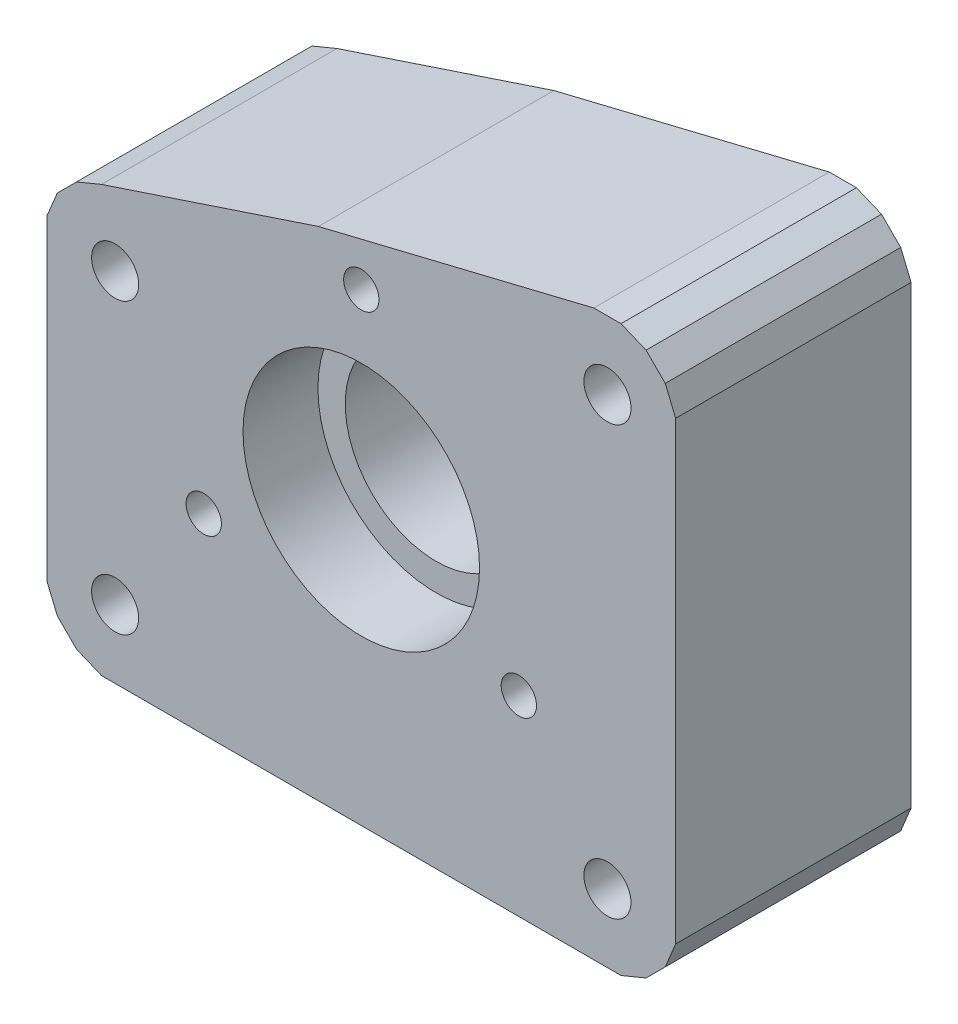
ISO-10303-21;
HEADER;
FILE_DESCRIPTION(('STEP AP214'),'2;1');
FILE_NAME('part.step','',(''),(''),'','','');
FILE_SCHEMA(('AUTOMOTIVE_DESIGN { 1 0 10303 214 1 1 1 1 }'));
ENDSEC;
DATA;
#1=APPLICATION_CONTEXT('core data for automotive mechanical design processes');
#2=APPLICATION_PROTOCOL_DEFINITION('international standard','automotive_design',2000,#1);
#3=PRODUCT_CONTEXT('',#1,'mechanical');
#4=PRODUCT('Part','Part','',(#3));
#5=PRODUCT_RELATED_PRODUCT_CATEGORY('part','',(#4));
#6=PRODUCT_DEFINITION_FORMATION('','',#4);
#7=PRODUCT_DEFINITION_CONTEXT('part definition',#1,'design');
#8=PRODUCT_DEFINITION('design','',#6,#7);
#9=PRODUCT_DEFINITION_SHAPE('','',#8);
#10=(LENGTH_UNIT() NAMED_UNIT(*) SI_UNIT(.MILLI.,.METRE.));
#11=(NAMED_UNIT(*) PLANE_ANGLE_UNIT() SI_UNIT($,.RADIAN.));
#12=(NAMED_UNIT(*) SI_UNIT($,.STERADIAN.) SOLID_ANGLE_UNIT());
#13=UNCERTAINTY_MEASURE_WITH_UNIT(LENGTH_MEASURE(1.E-05),#10,'distance_accuracy_value','');
#14=(GEOMETRIC_REPRESENTATION_CONTEXT(3) GLOBAL_UNCERTAINTY_ASSIGNED_CONTEXT((#13)) GLOBAL_UNIT_ASSIGNED_CONTEXT((#10,
#11,#12)) REPRESENTATION_CONTEXT('',''));
#15=CARTESIAN_POINT('',(0.,0.,0.));
#16=DIRECTION('',(0.,0.,1.));
#17=DIRECTION('',(1.,0.,0.));
#18=AXIS2_PLACEMENT_3D('',#15,#16,#17);
#19=CARTESIAN_POINT('',(0.,0.,56.));
#20=DIRECTION('',(0.,0.,-1.));
#21=DIRECTION('',(-1.,0.,0.));
#22=AXIS2_PLACEMENT_3D('',#19,#20,#21);
#23=CYLINDRICAL_SURFACE('',#22,8.5);
#24=CARTESIAN_POINT('',(0.,0.,41.));
#25=DIRECTION('',(0.,0.,1.));
#26=DIRECTION('',(1.,0.,0.));
#27=AXIS2_PLACEMENT_3D('',#24,#25,#26);
#28=CIRCLE('',#27,8.5);
#29=CARTESIAN_POINT('',(8.5,0.,41.));
#30=VERTEX_POINT('',#29);
#31=EDGE_CURVE('E280',#30,#30,#28,.T.);
#32=ORIENTED_EDGE('',*,*,#31,.F.);
#33=EDGE_LOOP('',(#32));
#34=FACE_BOUND('',#33,.T.);
#35=CARTESIAN_POINT('',(0.,0.,49.));
#36=DIRECTION('',(0.,0.,1.));
#37=DIRECTION('',(1.,0.,0.));
#38=AXIS2_PLACEMENT_3D('',#35,#36,#37);
#39=CIRCLE('',#38,8.5);
#40=CARTESIAN_POINT('',(8.5,0.,49.));
#41=VERTEX_POINT('',#40);
#42=EDGE_CURVE('E287',#41,#41,#39,.T.);
#43=ORIENTED_EDGE('',*,*,#42,.T.);
#44=EDGE_LOOP('',(#43));
#45=FACE_BOUND('',#44,.T.);
#46=ADVANCED_FACE('F43',(#34,#45),#23,.F.);
#47=CARTESIAN_POINT('',(0.,0.,56.));
#48=DIRECTION('',(0.,0.,1.));
#49=DIRECTION('',(1.,0.,0.));
#50=AXIS2_PLACEMENT_3D('',#47,#48,#49);
#51=PLANE('',#50);
#52=CARTESIAN_POINT('',(0.,0.,56.));
#53=DIRECTION('',(0.,0.,1.));
#54=DIRECTION('',(1.,0.,0.));
#55=AXIS2_PLACEMENT_3D('',#52,#53,#54);
#56=CIRCLE('',#55,11.05);
#57=CARTESIAN_POINT('',(11.05,0.,56.));
#58=VERTEX_POINT('',#57);
#59=EDGE_CURVE('E47',#58,#58,#56,.F.);
#60=ORIENTED_EDGE('',*,*,#59,.T.);
#61=EDGE_LOOP('',(#60));
#62=FACE_BOUND('',#61,.T.);
#63=CARTESIAN_POINT('',(-14.7224318643355,-8.5,56.));
#64=DIRECTION('',(0.,0.,1.));
#65=DIRECTION('',(1.,0.,0.));
#66=AXIS2_PLACEMENT_3D('',#63,#64,#65);
#67=CIRCLE('',#66,1.65);
#68=CARTESIAN_POINT('',(-13.0724318643355,-8.5,56.));
#69=VERTEX_POINT('',#68);
#70=EDGE_CURVE('E306',#69,#69,#67,.T.);
#71=ORIENTED_EDGE('',*,*,#70,.F.);
#72=EDGE_LOOP('',(#71));
#73=FACE_BOUND('',#72,.T.);
#74=CARTESIAN_POINT('',(23.,20.,56.));
#75=DIRECTION('',(0.,0.,1.));
#76=DIRECTION('',(1.,0.,0.));
#77=AXIS2_PLACEMENT_3D('',#74,#75,#76);
#78=CIRCLE('',#77,2.2);
#79=CARTESIAN_POINT('',(25.2,20.,56.));
#80=VERTEX_POINT('',#79);
#81=EDGE_CURVE('E318',#80,#80,#78,.T.);
#82=ORIENTED_EDGE('',*,*,#81,.F.);
#83=EDGE_LOOP('',(#82));
#84=FACE_BOUND('',#83,.T.);
#85=CARTESIAN_POINT('',(23.,-20.,56.));
#86=DIRECTION('',(0.,0.,1.));
#87=DIRECTION('',(1.,0.,0.));
#88=AXIS2_PLACEMENT_3D('',#85,#86,#87);
#89=CIRCLE('',#88,2.2);
#90=CARTESIAN_POINT('',(25.2,-20.,56.));
#91=VERTEX_POINT('',#90);
#92=EDGE_CURVE('E330',#91,#91,#89,.T.);
#93=ORIENTED_EDGE('',*,*,#92,.F.);
#94=EDGE_LOOP('',(#93));
#95=FACE_BOUND('',#94,.T.);
#96=DIRECTION('',(0.923879532511286,-0.382683432365091,0.));
#97=VECTOR('',#96,1.);
#98=CARTESIAN_POINT('',(-26.6112065146274,-25.4045524799665,56.));
#99=LINE('',#98,#97);
#100=CARTESIAN_POINT('',(-26.6112065146274,-25.4045524799665,56.));
#101=VERTEX_POINT('',#100);
#102=CARTESIAN_POINT('',(-24.2680870931048,-26.375104322621,56.));
#103=VERTEX_POINT('',#102);
#104=EDGE_CURVE('E238',#101,#103,#99,.T.);
#105=ORIENTED_EDGE('',*,*,#104,.T.);
#106=DIRECTION('',(1.,0.,0.));
#107=VECTOR('',#106,1.);
#108=CARTESIAN_POINT('',(-24.2680870931048,-26.375104322621,56.));
#109=LINE('',#108,#107);
#110=CARTESIAN_POINT('',(24.2680870931048,-26.375104322621,56.));
#111=VERTEX_POINT('',#110);
#112=EDGE_CURVE('E135',#103,#111,#109,.T.);
#113=ORIENTED_EDGE('',*,*,#112,.T.);
#114=DIRECTION('',(0.923879532511287,0.38268343236509,0.));
#115=VECTOR('',#114,1.);
#116=CARTESIAN_POINT('',(24.2680870931048,-26.375104322621,56.));
#117=LINE('',#116,#115);
#118=CARTESIAN_POINT('',(26.6112065146274,-25.4045524799665,56.));
#119=VERTEX_POINT('',#118);
#120=EDGE_CURVE('E342',#111,#119,#117,.T.);
#121=ORIENTED_EDGE('',*,*,#120,.T.);
#122=DIRECTION('',(0.707106781186548,0.707106781186547,0.));
#123=VECTOR('',#122,1.);
#124=CARTESIAN_POINT('',(26.6112065146274,-25.4045524799665,56.));
#125=LINE('',#124,#123);
#126=CARTESIAN_POINT('',(28.4045524799665,-23.6112065146274,56.));
#127=VERTEX_POINT('',#126);
#128=EDGE_CURVE('E344',#119,#127,#125,.T.);
#129=ORIENTED_EDGE('',*,*,#128,.T.);
#130=DIRECTION('',(0.382683432365089,0.923879532511287,0.));
#131=VECTOR('',#130,1.);
#132=CARTESIAN_POINT('',(28.4045524799665,-23.6112065146274,56.));
#133=LINE('',#132,#131);
#134=CARTESIAN_POINT('',(29.375104322621,-21.2680870931048,56.));
#135=VERTEX_POINT('',#134);
#136=EDGE_CURVE('E346',#127,#135,#133,.T.);
#137=ORIENTED_EDGE('',*,*,#136,.T.);
#138=DIRECTION('',(0.,1.,0.));
#139=VECTOR('',#138,1.);
#140=CARTESIAN_POINT('',(29.375104322621,-21.2680870931048,56.));
#141=LINE('',#140,#139);
#142=CARTESIAN_POINT('',(29.375104322621,21.2680870931048,56.));
#143=VERTEX_POINT('',#142);
#144=EDGE_CURVE('E348',#135,#143,#141,.T.);
#145=ORIENTED_EDGE('',*,*,#144,.T.);
#146=DIRECTION('',(-0.382683432365089,0.923879532511287,0.));
#147=VECTOR('',#146,1.);
#148=CARTESIAN_POINT('',(29.375104322621,21.2680870931048,56.));
#149=LINE('',#148,#147);
#150=CARTESIAN_POINT('',(28.4045524799665,23.6112065146274,56.));
#151=VERTEX_POINT('',#150);
#152=EDGE_CURVE('E350',#143,#151,#149,.T.);
#153=ORIENTED_EDGE('',*,*,#152,.T.);
#154=DIRECTION('',(-0.707106781186548,0.707106781186547,0.));
#155=VECTOR('',#154,1.);
#156=CARTESIAN_POINT('',(28.4045524799665,23.6112065146274,56.));
#157=LINE('',#156,#155);
#158=CARTESIAN_POINT('',(26.6112065146274,25.4045524799665,56.));
#159=VERTEX_POINT('',#158);
#160=EDGE_CURVE('E352',#151,#159,#157,.T.);
#161=ORIENTED_EDGE('',*,*,#160,.T.);
#162=DIRECTION('',(-0.923879532511286,0.382683432365091,0.));
#163=VECTOR('',#162,1.);
#164=CARTESIAN_POINT('',(26.6112065146274,25.4045524799665,56.));
#165=LINE('',#164,#163);
#166=CARTESIAN_POINT('',(24.2680870931048,26.375104322621,56.));
#167=VERTEX_POINT('',#166);
#168=EDGE_CURVE('E354',#159,#167,#165,.T.);
#169=ORIENTED_EDGE('',*,*,#168,.T.);
#170=DIRECTION('',(-1.,0.,0.));
#171=VECTOR('',#170,1.);
#172=CARTESIAN_POINT('',(24.2680870931048,26.375104322621,56.));
#173=LINE('',#172,#171);
#174=CARTESIAN_POINT('',(21.7319129068952,26.375104322621,56.));
#175=VERTEX_POINT('',#174);
#176=EDGE_CURVE('E356',#167,#175,#173,.T.);
#177=ORIENTED_EDGE('',*,*,#176,.T.);
#178=DIRECTION('',(-0.971580389978421,-0.236709834627504,0.));
#179=VECTOR('',#178,1.);
#180=CARTESIAN_POINT('',(21.7319129068952,26.375104322621,56.));
#181=LINE('',#180,#179);
#182=CARTESIAN_POINT('',(-3.99935160133063,20.1060982482662,56.));
#183=VERTEX_POINT('',#182);
#184=EDGE_CURVE('E358',#175,#183,#181,.T.);
#185=ORIENTED_EDGE('',*,*,#184,.T.);
#186=DIRECTION('',(-0.949037400798364,-0.315163468514175,0.));
#187=VECTOR('',#186,1.);
#188=CARTESIAN_POINT('',(-3.99935160133063,20.1060982482662,56.));
#189=LINE('',#188,#187);
#190=CARTESIAN_POINT('',(-24.2680870931048,13.375104322621,56.));
#191=VERTEX_POINT('',#190);
#192=EDGE_CURVE('E360',#183,#191,#189,.T.);
#193=ORIENTED_EDGE('',*,*,#192,.T.);
#194=DIRECTION('',(-0.923879532511287,-0.382683432365089,0.));
#195=VECTOR('',#194,1.);
#196=CARTESIAN_POINT('',(-24.2680870931048,13.375104322621,56.));
#197=LINE('',#196,#195);
#198=CARTESIAN_POINT('',(-26.6112065146274,12.4045524799665,56.));
#199=VERTEX_POINT('',#198);
#200=EDGE_CURVE('E362',#191,#199,#197,.T.);
#201=ORIENTED_EDGE('',*,*,#200,.T.);
#202=DIRECTION('',(-0.707106781186547,-0.707106781186547,0.));
#203=VECTOR('',#202,1.);
#204=CARTESIAN_POINT('',(-26.6112065146274,12.4045524799665,56.));
#205=LINE('',#204,#203);
#206=CARTESIAN_POINT('',(-28.4045524799665,10.6112065146274,56.));
#207=VERTEX_POINT('',#206);
#208=EDGE_CURVE('E364',#199,#207,#205,.T.);
#209=ORIENTED_EDGE('',*,*,#208,.T.);
#210=DIRECTION('',(-0.38268343236509,-0.923879532511287,0.));
#211=VECTOR('',#210,1.);
#212=CARTESIAN_POINT('',(-28.4045524799665,10.6112065146274,56.));
#213=LINE('',#212,#211);
#214=CARTESIAN_POINT('',(-29.375104322621,8.26808709310483,56.));
#215=VERTEX_POINT('',#214);
#216=EDGE_CURVE('E185',#207,#215,#213,.T.);
#217=ORIENTED_EDGE('',*,*,#216,.T.);
#218=DIRECTION('',(0.,-1.,0.));
#219=VECTOR('',#218,1.);
#220=CARTESIAN_POINT('',(-29.375104322621,8.26808709310483,56.));
#221=LINE('',#220,#219);
#222=CARTESIAN_POINT('',(-29.375104322621,-21.2680870931048,56.));
#223=VERTEX_POINT('',#222);
#224=EDGE_CURVE('E178',#215,#223,#221,.T.);
#225=ORIENTED_EDGE('',*,*,#224,.T.);
#226=DIRECTION('',(0.382683432365089,-0.923879532511287,0.));
#227=VECTOR('',#226,1.);
#228=CARTESIAN_POINT('',(-29.375104322621,-21.2680870931048,56.));
#229=LINE('',#228,#227);
#230=CARTESIAN_POINT('',(-28.4045524799665,-23.6112065146274,56.));
#231=VERTEX_POINT('',#230);
#232=EDGE_CURVE('E183',#223,#231,#229,.T.);
#233=ORIENTED_EDGE('',*,*,#232,.T.);
#234=DIRECTION('',(0.707106781186548,-0.707106781186547,0.));
#235=VECTOR('',#234,1.);
#236=CARTESIAN_POINT('',(-28.4045524799665,-23.6112065146274,56.));
#237=LINE('',#236,#235);
#238=EDGE_CURVE('E62',#231,#101,#237,.T.);
#239=ORIENTED_EDGE('',*,*,#238,.T.);
#240=EDGE_LOOP('',(#105,#113,#121,#129,#137,#145,#153,#161,#169,#177,#185,#193,#201,#209,#217,
#225,#233,#239));
#241=FACE_BOUND('',#240,.T.);
#242=CARTESIAN_POINT('',(-23.,-20.,56.));
#243=DIRECTION('',(0.,0.,1.));
#244=DIRECTION('',(1.,0.,0.));
#245=AXIS2_PLACEMENT_3D('',#242,#243,#244);
#246=CIRCLE('',#245,2.2);
#247=CARTESIAN_POINT('',(-20.8,-20.,56.));
#248=VERTEX_POINT('',#247);
#249=EDGE_CURVE('E207',#248,#248,#246,.T.);
#250=ORIENTED_EDGE('',*,*,#249,.F.);
#251=EDGE_LOOP('',(#250));
#252=FACE_BOUND('',#251,.T.);
#253=CARTESIAN_POINT('',(-23.,7.,56.));
#254=DIRECTION('',(0.,0.,1.));
#255=DIRECTION('',(1.,0.,0.));
#256=AXIS2_PLACEMENT_3D('',#253,#254,#255);
#257=CIRCLE('',#256,2.2);
#258=CARTESIAN_POINT('',(-20.8,7.,56.));
#259=VERTEX_POINT('',#258);
#260=EDGE_CURVE('E324',#259,#259,#257,.T.);
#261=ORIENTED_EDGE('',*,*,#260,.F.);
#262=EDGE_LOOP('',(#261));
#263=FACE_BOUND('',#262,.T.);
#264=CARTESIAN_POINT('',(0.,17.,56.));
#265=DIRECTION('',(0.,0.,1.));
#266=DIRECTION('',(1.,0.,0.));
#267=AXIS2_PLACEMENT_3D('',#264,#265,#266);
#268=CIRCLE('',#267,1.65);
#269=CARTESIAN_POINT('',(1.65,17.,56.));
#270=VERTEX_POINT('',#269);
#271=EDGE_CURVE('E312',#270,#270,#268,.T.);
#272=ORIENTED_EDGE('',*,*,#271,.F.);
#273=EDGE_LOOP('',(#272));
#274=FACE_BOUND('',#273,.T.);
#275=CARTESIAN_POINT('',(14.7224318643355,-8.50000000000001,56.));
#276=DIRECTION('',(0.,0.,1.));
#277=DIRECTION('',(1.,0.,0.));
#278=AXIS2_PLACEMENT_3D('',#275,#276,#277);
#279=CIRCLE('',#278,1.65);
#280=CARTESIAN_POINT('',(16.3724318643355,-8.50000000000001,56.));
#281=VERTEX_POINT('',#280);
#282=EDGE_CURVE('E300',#281,#281,#279,.T.);
#283=ORIENTED_EDGE('',*,*,#282,.F.);
#284=EDGE_LOOP('',(#283));
#285=FACE_BOUND('',#284,.T.);
#286=ADVANCED_FACE('F180',(#62,#73,#84,#95,#241,#252,#263,#274,#285),#51,.T.);
#287=CARTESIAN_POINT('',(0.,0.,34.));
#288=DIRECTION('',(0.,0.,1.));
#289=DIRECTION('',(1.,0.,0.));
#290=AXIS2_PLACEMENT_3D('',#287,#288,#289);
#291=PLANE('',#290);
#292=CARTESIAN_POINT('',(0.,0.,34.));
#293=DIRECTION('',(0.,0.,1.));
#294=DIRECTION('',(1.,0.,0.));
#295=AXIS2_PLACEMENT_3D('',#292,#293,#294);
#296=CIRCLE('',#295,11.05);
#297=CARTESIAN_POINT('',(11.05,0.,34.));
#298=VERTEX_POINT('',#297);
#299=EDGE_CURVE('E283',#298,#298,#296,.F.);
#300=ORIENTED_EDGE('',*,*,#299,.F.);
#301=EDGE_LOOP('',(#300));
#302=FACE_BOUND('',#301,.T.);
#303=DIRECTION('',(0.923879532511286,-0.382683432365091,0.));
#304=VECTOR('',#303,1.);
#305=CARTESIAN_POINT('',(-26.6112065146274,-25.4045524799665,34.));
#306=LINE('',#305,#304);
#307=CARTESIAN_POINT('',(-26.6112065146274,-25.4045524799665,34.));
#308=VERTEX_POINT('',#307);
#309=CARTESIAN_POINT('',(-24.2680870931048,-26.375104322621,34.));
#310=VERTEX_POINT('',#309);
#311=EDGE_CURVE('E203',#308,#310,#306,.T.);
#312=ORIENTED_EDGE('',*,*,#311,.F.);
#313=DIRECTION('',(0.707106781186548,-0.707106781186547,0.));
#314=VECTOR('',#313,1.);
#315=CARTESIAN_POINT('',(-28.4045524799665,-23.6112065146274,34.));
#316=LINE('',#315,#314);
#317=CARTESIAN_POINT('',(-28.4045524799665,-23.6112065146274,34.));
#318=VERTEX_POINT('',#317);
#319=EDGE_CURVE('E127',#318,#308,#316,.T.);
#320=ORIENTED_EDGE('',*,*,#319,.F.);
#321=DIRECTION('',(0.382683432365089,-0.923879532511287,0.));
#322=VECTOR('',#321,1.);
#323=CARTESIAN_POINT('',(-29.375104322621,-21.2680870931048,34.));
#324=LINE('',#323,#322);
#325=CARTESIAN_POINT('',(-29.375104322621,-21.2680870931048,34.));
#326=VERTEX_POINT('',#325);
#327=EDGE_CURVE('E121',#326,#318,#324,.T.);
#328=ORIENTED_EDGE('',*,*,#327,.F.);
#329=DIRECTION('',(0.,-1.,0.));
#330=VECTOR('',#329,1.);
#331=CARTESIAN_POINT('',(-29.375104322621,8.26808709310483,34.));
#332=LINE('',#331,#330);
#333=CARTESIAN_POINT('',(-29.375104322621,8.26808709310483,34.));
#334=VERTEX_POINT('',#333);
#335=EDGE_CURVE('E193',#334,#326,#332,.T.);
#336=ORIENTED_EDGE('',*,*,#335,.F.);
#337=DIRECTION('',(-0.38268343236509,-0.923879532511287,0.));
#338=VECTOR('',#337,1.);
#339=CARTESIAN_POINT('',(-28.4045524799665,10.6112065146274,34.));
#340=LINE('',#339,#338);
#341=CARTESIAN_POINT('',(-28.4045524799665,10.6112065146274,34.));
#342=VERTEX_POINT('',#341);
#343=EDGE_CURVE('E233',#342,#334,#340,.T.);
#344=ORIENTED_EDGE('',*,*,#343,.F.);
#345=DIRECTION('',(-0.707106781186547,-0.707106781186547,0.));
#346=VECTOR('',#345,1.);
#347=CARTESIAN_POINT('',(-26.6112065146274,12.4045524799665,34.));
#348=LINE('',#347,#346);
#349=CARTESIAN_POINT('',(-26.6112065146274,12.4045524799665,34.));
#350=VERTEX_POINT('',#349);
#351=EDGE_CURVE('E231',#350,#342,#348,.T.);
#352=ORIENTED_EDGE('',*,*,#351,.F.);
#353=DIRECTION('',(-0.923879532511287,-0.382683432365089,0.));
#354=VECTOR('',#353,1.);
#355=CARTESIAN_POINT('',(-24.2680870931048,13.375104322621,34.));
#356=LINE('',#355,#354);
#357=CARTESIAN_POINT('',(-24.2680870931048,13.375104322621,34.));
#358=VERTEX_POINT('',#357);
#359=EDGE_CURVE('E229',#358,#350,#356,.T.);
#360=ORIENTED_EDGE('',*,*,#359,.F.);
#361=DIRECTION('',(-0.949037400798364,-0.315163468514175,0.));
#362=VECTOR('',#361,1.);
#363=CARTESIAN_POINT('',(-3.99935160133063,20.1060982482662,34.));
#364=LINE('',#363,#362);
#365=CARTESIAN_POINT('',(-3.99935160133063,20.1060982482662,34.));
#366=VERTEX_POINT('',#365);
#367=EDGE_CURVE('E227',#366,#358,#364,.T.);
#368=ORIENTED_EDGE('',*,*,#367,.F.);
#369=DIRECTION('',(-0.971580389978421,-0.236709834627504,0.));
#370=VECTOR('',#369,1.);
#371=CARTESIAN_POINT('',(21.7319129068952,26.375104322621,34.));
#372=LINE('',#371,#370);
#373=CARTESIAN_POINT('',(21.7319129068952,26.375104322621,34.));
#374=VERTEX_POINT('',#373);
#375=EDGE_CURVE('E225',#374,#366,#372,.T.);
#376=ORIENTED_EDGE('',*,*,#375,.F.);
#377=DIRECTION('',(-1.,0.,0.));
#378=VECTOR('',#377,1.);
#379=CARTESIAN_POINT('',(24.2680870931048,26.375104322621,34.));
#380=LINE('',#379,#378);
#381=CARTESIAN_POINT('',(24.2680870931048,26.375104322621,34.));
#382=VERTEX_POINT('',#381);
#383=EDGE_CURVE('E223',#382,#374,#380,.T.);
#384=ORIENTED_EDGE('',*,*,#383,.F.);
#385=DIRECTION('',(-0.923879532511286,0.382683432365091,0.));
#386=VECTOR('',#385,1.);
#387=CARTESIAN_POINT('',(26.6112065146274,25.4045524799665,34.));
#388=LINE('',#387,#386);
#389=CARTESIAN_POINT('',(26.6112065146274,25.4045524799665,34.));
#390=VERTEX_POINT('',#389);
#391=EDGE_CURVE('E221',#390,#382,#388,.T.);
#392=ORIENTED_EDGE('',*,*,#391,.F.);
#393=DIRECTION('',(-0.707106781186548,0.707106781186547,0.));
#394=VECTOR('',#393,1.);
#395=CARTESIAN_POINT('',(28.4045524799665,23.6112065146274,34.));
#396=LINE('',#395,#394);
#397=CARTESIAN_POINT('',(28.4045524799665,23.6112065146274,34.));
#398=VERTEX_POINT('',#397);
#399=EDGE_CURVE('E219',#398,#390,#396,.T.);
#400=ORIENTED_EDGE('',*,*,#399,.F.);
#401=DIRECTION('',(-0.382683432365089,0.923879532511287,0.));
#402=VECTOR('',#401,1.);
#403=CARTESIAN_POINT('',(29.375104322621,21.2680870931048,34.));
#404=LINE('',#403,#402);
#405=CARTESIAN_POINT('',(29.375104322621,21.2680870931048,34.));
#406=VERTEX_POINT('',#405);
#407=EDGE_CURVE('E217',#406,#398,#404,.T.);
#408=ORIENTED_EDGE('',*,*,#407,.F.);
#409=DIRECTION('',(0.,1.,0.));
#410=VECTOR('',#409,1.);
#411=CARTESIAN_POINT('',(29.375104322621,-21.2680870931048,34.));
#412=LINE('',#411,#410);
#413=CARTESIAN_POINT('',(29.375104322621,-21.2680870931048,34.));
#414=VERTEX_POINT('',#413);
#415=EDGE_CURVE('E215',#414,#406,#412,.T.);
#416=ORIENTED_EDGE('',*,*,#415,.F.);
#417=DIRECTION('',(0.382683432365089,0.923879532511287,0.));
#418=VECTOR('',#417,1.);
#419=CARTESIAN_POINT('',(28.4045524799665,-23.6112065146274,34.));
#420=LINE('',#419,#418);
#421=CARTESIAN_POINT('',(28.4045524799665,-23.6112065146274,34.));
#422=VERTEX_POINT('',#421);
#423=EDGE_CURVE('E213',#422,#414,#420,.T.);
#424=ORIENTED_EDGE('',*,*,#423,.F.);
#425=DIRECTION('',(0.707106781186548,0.707106781186547,0.));
#426=VECTOR('',#425,1.);
#427=CARTESIAN_POINT('',(26.6112065146274,-25.4045524799665,34.));
#428=LINE('',#427,#426);
#429=CARTESIAN_POINT('',(26.6112065146274,-25.4045524799665,34.));
#430=VERTEX_POINT('',#429);
#431=EDGE_CURVE('E211',#430,#422,#428,.T.);
#432=ORIENTED_EDGE('',*,*,#431,.F.);
#433=DIRECTION('',(0.923879532511287,0.38268343236509,0.));
#434=VECTOR('',#433,1.);
#435=CARTESIAN_POINT('',(24.2680870931048,-26.375104322621,34.));
#436=LINE('',#435,#434);
#437=CARTESIAN_POINT('',(24.2680870931048,-26.375104322621,34.));
#438=VERTEX_POINT('',#437);
#439=EDGE_CURVE('E209',#438,#430,#436,.T.);
#440=ORIENTED_EDGE('',*,*,#439,.F.);
#441=DIRECTION('',(1.,0.,0.));
#442=VECTOR('',#441,1.);
#443=CARTESIAN_POINT('',(-24.2680870931048,-26.375104322621,34.));
#444=LINE('',#443,#442);
#445=EDGE_CURVE('E206',#310,#438,#444,.T.);
#446=ORIENTED_EDGE('',*,*,#445,.F.);
#447=EDGE_LOOP('',(#312,#320,#328,#336,#344,#352,#360,#368,#376,#384,#392,#400,#408,#416,#424,
#432,#440,#446));
#448=FACE_BOUND('',#447,.T.);
#449=CARTESIAN_POINT('',(-23.,-20.,34.));
#450=DIRECTION('',(0.,0.,1.));
#451=DIRECTION('',(1.,0.,0.));
#452=AXIS2_PLACEMENT_3D('',#449,#450,#451);
#453=CIRCLE('',#452,2.2);
#454=CARTESIAN_POINT('',(-20.8,-20.,34.));
#455=VERTEX_POINT('',#454);
#456=EDGE_CURVE('E333',#455,#455,#453,.T.);
#457=ORIENTED_EDGE('',*,*,#456,.T.);
#458=EDGE_LOOP('',(#457));
#459=FACE_BOUND('',#458,.T.);
#460=CARTESIAN_POINT('',(23.,-20.,34.));
#461=DIRECTION('',(0.,0.,1.));
#462=DIRECTION('',(1.,0.,0.));
#463=AXIS2_PLACEMENT_3D('',#460,#461,#462);
#464=CIRCLE('',#463,2.2);
#465=CARTESIAN_POINT('',(25.2,-20.,34.));
#466=VERTEX_POINT('',#465);
#467=EDGE_CURVE('E327',#466,#466,#464,.T.);
#468=ORIENTED_EDGE('',*,*,#467,.T.);
#469=EDGE_LOOP('',(#468));
#470=FACE_BOUND('',#469,.T.);
#471=CARTESIAN_POINT('',(-23.,7.,34.));
#472=DIRECTION('',(0.,0.,1.));
#473=DIRECTION('',(1.,0.,0.));
#474=AXIS2_PLACEMENT_3D('',#471,#472,#473);
#475=CIRCLE('',#474,2.2);
#476=CARTESIAN_POINT('',(-20.8,7.,34.));
#477=VERTEX_POINT('',#476);
#478=EDGE_CURVE('E321',#477,#477,#475,.T.);
#479=ORIENTED_EDGE('',*,*,#478,.T.);
#480=EDGE_LOOP('',(#479));
#481=FACE_BOUND('',#480,.T.);
#482=CARTESIAN_POINT('',(23.,20.,34.));
#483=DIRECTION('',(0.,0.,1.));
#484=DIRECTION('',(1.,0.,0.));
#485=AXIS2_PLACEMENT_3D('',#482,#483,#484);
#486=CIRCLE('',#485,2.2);
#487=CARTESIAN_POINT('',(25.2,20.,34.));
#488=VERTEX_POINT('',#487);
#489=EDGE_CURVE('E315',#488,#488,#486,.T.);
#490=ORIENTED_EDGE('',*,*,#489,.T.);
#491=EDGE_LOOP('',(#490));
#492=FACE_BOUND('',#491,.T.);
#493=CARTESIAN_POINT('',(0.,17.,34.));
#494=DIRECTION('',(0.,0.,1.));
#495=DIRECTION('',(1.,0.,0.));
#496=AXIS2_PLACEMENT_3D('',#493,#494,#495);
#497=CIRCLE('',#496,1.65);
#498=CARTESIAN_POINT('',(1.65,17.,34.));
#499=VERTEX_POINT('',#498);
#500=EDGE_CURVE('E309',#499,#499,#497,.T.);
#501=ORIENTED_EDGE('',*,*,#500,.T.);
#502=EDGE_LOOP('',(#501));
#503=FACE_BOUND('',#502,.T.);
#504=CARTESIAN_POINT('',(-14.7224318643355,-8.5,34.));
#505=DIRECTION('',(0.,0.,1.));
#506=DIRECTION('',(1.,0.,0.));
#507=AXIS2_PLACEMENT_3D('',#504,#505,#506);
#508=CIRCLE('',#507,1.65);
#509=CARTESIAN_POINT('',(-13.0724318643355,-8.5,34.));
#510=VERTEX_POINT('',#509);
#511=EDGE_CURVE('E303',#510,#510,#508,.T.);
#512=ORIENTED_EDGE('',*,*,#511,.T.);
#513=EDGE_LOOP('',(#512));
#514=FACE_BOUND('',#513,.T.);
#515=CARTESIAN_POINT('',(14.7224318643355,-8.50000000000001,34.));
#516=DIRECTION('',(0.,0.,1.));
#517=DIRECTION('',(1.,0.,0.));
#518=AXIS2_PLACEMENT_3D('',#515,#516,#517);
#519=CIRCLE('',#518,1.65);
#520=CARTESIAN_POINT('',(16.3724318643355,-8.50000000000001,34.));
#521=VERTEX_POINT('',#520);
#522=EDGE_CURVE('E286',#521,#521,#519,.T.);
#523=ORIENTED_EDGE('',*,*,#522,.T.);
#524=EDGE_LOOP('',(#523));
#525=FACE_BOUND('',#524,.T.);
#526=ADVANCED_FACE('F377',(#302,#448,#459,#470,#481,#492,#503,#514,#525),#291,.F.);
#527=CARTESIAN_POINT('',(-26.6112065146274,-25.4045524799665,56.));
#528=DIRECTION('',(0.382683432365091,0.923879532511286,0.));
#529=DIRECTION('',(-0.923879532511286,0.382683432365091,0.));
#530=AXIS2_PLACEMENT_3D('',#527,#528,#529);
#531=PLANE('',#530);
#532=ORIENTED_EDGE('',*,*,#311,.T.);
#533=DIRECTION('',(0.,0.,-1.));
#534=VECTOR('',#533,1.);
#535=CARTESIAN_POINT('',(-24.2680870931048,-26.375104322621,56.));
#536=LINE('',#535,#534);
#537=EDGE_CURVE('E11',#103,#310,#536,.T.);
#538=ORIENTED_EDGE('',*,*,#537,.F.);
#539=ORIENTED_EDGE('',*,*,#104,.F.);
#540=DIRECTION('',(0.,0.,-1.));
#541=VECTOR('',#540,1.);
#542=CARTESIAN_POINT('',(-26.6112065146274,-25.4045524799665,56.));
#543=LINE('',#542,#541);
#544=EDGE_CURVE('E199',#101,#308,#543,.T.);
#545=ORIENTED_EDGE('',*,*,#544,.T.);
#546=EDGE_LOOP('',(#532,#538,#539,#545));
#547=FACE_BOUND('',#546,.T.);
#548=ADVANCED_FACE('F45',(#547),#531,.F.);
#549=CARTESIAN_POINT('',(-24.2680870931048,-26.375104322621,56.));
#550=DIRECTION('',(0.,1.,0.));
#551=DIRECTION('',(0.,0.,1.));
#552=AXIS2_PLACEMENT_3D('',#549,#550,#551);
#553=PLANE('',#552);
#554=ORIENTED_EDGE('',*,*,#445,.T.);
#555=DIRECTION('',(0.,0.,-1.));
#556=VECTOR('',#555,1.);
#557=CARTESIAN_POINT('',(24.2680870931048,-26.375104322621,56.));
#558=LINE('',#557,#556);
#559=EDGE_CURVE('E53',#111,#438,#558,.T.);
#560=ORIENTED_EDGE('',*,*,#559,.F.);
#561=ORIENTED_EDGE('',*,*,#112,.F.);
#562=ORIENTED_EDGE('',*,*,#537,.T.);
#563=EDGE_LOOP('',(#554,#560,#561,#562));
#564=FACE_BOUND('',#563,.T.);
#565=ADVANCED_FACE('F414',(#564),#553,.F.);
#566=CARTESIAN_POINT('',(24.2680870931048,-26.375104322621,56.));
#567=DIRECTION('',(-0.38268343236509,0.923879532511287,0.));
#568=DIRECTION('',(-0.923879532511287,-0.38268343236509,0.));
#569=AXIS2_PLACEMENT_3D('',#566,#567,#568);
#570=PLANE('',#569);
#571=ORIENTED_EDGE('',*,*,#439,.T.);
#572=DIRECTION('',(0.,0.,-1.));
#573=VECTOR('',#572,1.);
#574=CARTESIAN_POINT('',(26.6112065146274,-25.4045524799665,56.));
#575=LINE('',#574,#573);
#576=EDGE_CURVE('E275',#119,#430,#575,.T.);
#577=ORIENTED_EDGE('',*,*,#576,.F.);
#578=ORIENTED_EDGE('',*,*,#120,.F.);
#579=ORIENTED_EDGE('',*,*,#559,.T.);
#580=EDGE_LOOP('',(#571,#577,#578,#579));
#581=FACE_BOUND('',#580,.T.);
#582=ADVANCED_FACE('F555',(#581),#570,.F.);
#583=CARTESIAN_POINT('',(26.6112065146274,-25.4045524799665,56.));
#584=DIRECTION('',(-0.707106781186547,0.707106781186548,0.));
#585=DIRECTION('',(-0.707106781186548,-0.707106781186547,0.));
#586=AXIS2_PLACEMENT_3D('',#583,#584,#585);
#587=PLANE('',#586);
#588=ORIENTED_EDGE('',*,*,#431,.T.);
#589=DIRECTION('',(0.,0.,-1.));
#590=VECTOR('',#589,1.);
#591=CARTESIAN_POINT('',(28.4045524799665,-23.6112065146274,56.));
#592=LINE('',#591,#590);
#593=EDGE_CURVE('E272',#127,#422,#592,.T.);
#594=ORIENTED_EDGE('',*,*,#593,.F.);
#595=ORIENTED_EDGE('',*,*,#128,.F.);
#596=ORIENTED_EDGE('',*,*,#576,.T.);
#597=EDGE_LOOP('',(#588,#594,#595,#596));
#598=FACE_BOUND('',#597,.T.);
#599=ADVANCED_FACE('F563',(#598),#587,.F.);
#600=CARTESIAN_POINT('',(28.4045524799665,-23.6112065146274,56.));
#601=DIRECTION('',(-0.923879532511287,0.382683432365089,0.));
#602=DIRECTION('',(-0.382683432365089,-0.923879532511287,0.));
#603=AXIS2_PLACEMENT_3D('',#600,#601,#602);
#604=PLANE('',#603);
#605=ORIENTED_EDGE('',*,*,#423,.T.);
#606=DIRECTION('',(0.,0.,-1.));
#607=VECTOR('',#606,1.);
#608=CARTESIAN_POINT('',(29.375104322621,-21.2680870931048,56.));
#609=LINE('',#608,#607);
#610=EDGE_CURVE('E269',#135,#414,#609,.T.);
#611=ORIENTED_EDGE('',*,*,#610,.F.);
#612=ORIENTED_EDGE('',*,*,#136,.F.);
#613=ORIENTED_EDGE('',*,*,#593,.T.);
#614=EDGE_LOOP('',(#605,#611,#612,#613));
#615=FACE_BOUND('',#614,.T.);
#616=ADVANCED_FACE('F573',(#615),#604,.F.);
#617=CARTESIAN_POINT('',(29.375104322621,-21.2680870931048,56.));
#618=DIRECTION('',(-1.,0.,0.));
#619=DIRECTION('',(0.,0.,1.));
#620=AXIS2_PLACEMENT_3D('',#617,#618,#619);
#621=PLANE('',#620);
#622=ORIENTED_EDGE('',*,*,#415,.T.);
#623=DIRECTION('',(0.,0.,-1.));
#624=VECTOR('',#623,1.);
#625=CARTESIAN_POINT('',(29.375104322621,21.2680870931048,56.));
#626=LINE('',#625,#624);
#627=EDGE_CURVE('E266',#143,#406,#626,.T.);
#628=ORIENTED_EDGE('',*,*,#627,.F.);
#629=ORIENTED_EDGE('',*,*,#144,.F.);
#630=ORIENTED_EDGE('',*,*,#610,.T.);
#631=EDGE_LOOP('',(#622,#628,#629,#630));
#632=FACE_BOUND('',#631,.T.);
#633=ADVANCED_FACE('F583',(#632),#621,.F.);
#634=CARTESIAN_POINT('',(29.375104322621,21.2680870931048,56.));
#635=DIRECTION('',(-0.923879532511287,-0.382683432365089,0.));
#636=DIRECTION('',(0.382683432365089,-0.923879532511287,0.));
#637=AXIS2_PLACEMENT_3D('',#634,#635,#636);
#638=PLANE('',#637);
#639=ORIENTED_EDGE('',*,*,#407,.T.);
#640=DIRECTION('',(0.,0.,-1.));
#641=VECTOR('',#640,1.);
#642=CARTESIAN_POINT('',(28.4045524799665,23.6112065146274,56.));
#643=LINE('',#642,#641);
#644=EDGE_CURVE('E263',#151,#398,#643,.T.);
#645=ORIENTED_EDGE('',*,*,#644,.F.);
#646=ORIENTED_EDGE('',*,*,#152,.F.);
#647=ORIENTED_EDGE('',*,*,#627,.T.);
#648=EDGE_LOOP('',(#639,#645,#646,#647));
#649=FACE_BOUND('',#648,.T.);
#650=ADVANCED_FACE('F593',(#649),#638,.F.);
#651=CARTESIAN_POINT('',(28.4045524799665,23.6112065146274,56.));
#652=DIRECTION('',(-0.707106781186547,-0.707106781186548,0.));
#653=DIRECTION('',(0.707106781186548,-0.707106781186547,0.));
#654=AXIS2_PLACEMENT_3D('',#651,#652,#653);
#655=PLANE('',#654);
#656=ORIENTED_EDGE('',*,*,#399,.T.);
#657=DIRECTION('',(0.,0.,-1.));
#658=VECTOR('',#657,1.);
#659=CARTESIAN_POINT('',(26.6112065146274,25.4045524799665,56.));
#660=LINE('',#659,#658);
#661=EDGE_CURVE('E260',#159,#390,#660,.T.);
#662=ORIENTED_EDGE('',*,*,#661,.F.);
#663=ORIENTED_EDGE('',*,*,#160,.F.);
#664=ORIENTED_EDGE('',*,*,#644,.T.);
#665=EDGE_LOOP('',(#656,#662,#663,#664));
#666=FACE_BOUND('',#665,.T.);
#667=ADVANCED_FACE('F603',(#666),#655,.F.);
#668=CARTESIAN_POINT('',(26.6112065146274,25.4045524799665,56.));
#669=DIRECTION('',(-0.382683432365091,-0.923879532511286,0.));
#670=DIRECTION('',(0.923879532511286,-0.382683432365091,0.));
#671=AXIS2_PLACEMENT_3D('',#668,#669,#670);
#672=PLANE('',#671);
#673=ORIENTED_EDGE('',*,*,#391,.T.);
#674=DIRECTION('',(0.,0.,-1.));
#675=VECTOR('',#674,1.);
#676=CARTESIAN_POINT('',(24.2680870931048,26.375104322621,56.));
#677=LINE('',#676,#675);
#678=EDGE_CURVE('E257',#167,#382,#677,.T.);
#679=ORIENTED_EDGE('',*,*,#678,.F.);
#680=ORIENTED_EDGE('',*,*,#168,.F.);
#681=ORIENTED_EDGE('',*,*,#661,.T.);
#682=EDGE_LOOP('',(#673,#679,#680,#681));
#683=FACE_BOUND('',#682,.T.);
#684=ADVANCED_FACE('F613',(#683),#672,.F.);
#685=CARTESIAN_POINT('',(24.2680870931048,26.375104322621,56.));
#686=DIRECTION('',(0.,-1.,0.));
#687=DIRECTION('',(0.,0.,-1.));
#688=AXIS2_PLACEMENT_3D('',#685,#686,#687);
#689=PLANE('',#688);
#690=ORIENTED_EDGE('',*,*,#383,.T.);
#691=DIRECTION('',(0.,0.,-1.));
#692=VECTOR('',#691,1.);
#693=CARTESIAN_POINT('',(21.7319129068952,26.375104322621,56.));
#694=LINE('',#693,#692);
#695=EDGE_CURVE('E254',#175,#374,#694,.T.);
#696=ORIENTED_EDGE('',*,*,#695,.F.);
#697=ORIENTED_EDGE('',*,*,#176,.F.);
#698=ORIENTED_EDGE('',*,*,#678,.T.);
#699=EDGE_LOOP('',(#690,#696,#697,#698));
#700=FACE_BOUND('',#699,.T.);
#701=ADVANCED_FACE('F623',(#700),#689,.F.);
#702=CARTESIAN_POINT('',(21.7319129068952,26.375104322621,56.));
#703=DIRECTION('',(0.236709834627504,-0.971580389978421,0.));
#704=DIRECTION('',(0.971580389978421,0.236709834627504,0.));
#705=AXIS2_PLACEMENT_3D('',#702,#703,#704);
#706=PLANE('',#705);
#707=ORIENTED_EDGE('',*,*,#375,.T.);
#708=DIRECTION('',(0.,0.,-1.));
#709=VECTOR('',#708,1.);
#710=CARTESIAN_POINT('',(-3.99935160133063,20.1060982482662,56.));
#711=LINE('',#710,#709);
#712=EDGE_CURVE('E251',#183,#366,#711,.T.);
#713=ORIENTED_EDGE('',*,*,#712,.F.);
#714=ORIENTED_EDGE('',*,*,#184,.F.);
#715=ORIENTED_EDGE('',*,*,#695,.T.);
#716=EDGE_LOOP('',(#707,#713,#714,#715));
#717=FACE_BOUND('',#716,.T.);
#718=ADVANCED_FACE('F633',(#717),#706,.F.);
#719=CARTESIAN_POINT('',(-3.99935160133063,20.1060982482662,56.));
#720=DIRECTION('',(0.315163468514175,-0.949037400798364,0.));
#721=DIRECTION('',(0.949037400798364,0.315163468514175,0.));
#722=AXIS2_PLACEMENT_3D('',#719,#720,#721);
#723=PLANE('',#722);
#724=ORIENTED_EDGE('',*,*,#367,.T.);
#725=DIRECTION('',(0.,0.,-1.));
#726=VECTOR('',#725,1.);
#727=CARTESIAN_POINT('',(-24.2680870931048,13.375104322621,56.));
#728=LINE('',#727,#726);
#729=EDGE_CURVE('E248',#191,#358,#728,.T.);
#730=ORIENTED_EDGE('',*,*,#729,.F.);
#731=ORIENTED_EDGE('',*,*,#192,.F.);
#732=ORIENTED_EDGE('',*,*,#712,.T.);
#733=EDGE_LOOP('',(#724,#730,#731,#732));
#734=FACE_BOUND('',#733,.T.);
#735=ADVANCED_FACE('F643',(#734),#723,.F.);
#736=CARTESIAN_POINT('',(-24.2680870931048,13.375104322621,56.));
#737=DIRECTION('',(0.38268343236509,-0.923879532511287,0.));
#738=DIRECTION('',(0.923879532511287,0.38268343236509,0.));
#739=AXIS2_PLACEMENT_3D('',#736,#737,#738);
#740=PLANE('',#739);
#741=ORIENTED_EDGE('',*,*,#359,.T.);
#742=DIRECTION('',(0.,0.,-1.));
#743=VECTOR('',#742,1.);
#744=CARTESIAN_POINT('',(-26.6112065146274,12.4045524799665,56.));
#745=LINE('',#744,#743);
#746=EDGE_CURVE('E245',#199,#350,#745,.T.);
#747=ORIENTED_EDGE('',*,*,#746,.F.);
#748=ORIENTED_EDGE('',*,*,#200,.F.);
#749=ORIENTED_EDGE('',*,*,#729,.T.);
#750=EDGE_LOOP('',(#741,#747,#748,#749));
#751=FACE_BOUND('',#750,.T.);
#752=ADVANCED_FACE('F653',(#751),#740,.F.);
#753=CARTESIAN_POINT('',(-26.6112065146274,12.4045524799665,56.));
#754=DIRECTION('',(0.707106781186548,-0.707106781186548,0.));
#755=DIRECTION('',(0.707106781186548,0.707106781186548,0.));
#756=AXIS2_PLACEMENT_3D('',#753,#754,#755);
#757=PLANE('',#756);
#758=ORIENTED_EDGE('',*,*,#351,.T.);
#759=DIRECTION('',(0.,0.,-1.));
#760=VECTOR('',#759,1.);
#761=CARTESIAN_POINT('',(-28.4045524799665,10.6112065146274,56.));
#762=LINE('',#761,#760);
#763=EDGE_CURVE('E242',#207,#342,#762,.T.);
#764=ORIENTED_EDGE('',*,*,#763,.F.);
#765=ORIENTED_EDGE('',*,*,#208,.F.);
#766=ORIENTED_EDGE('',*,*,#746,.T.);
#767=EDGE_LOOP('',(#758,#764,#765,#766));
#768=FACE_BOUND('',#767,.T.);
#769=ADVANCED_FACE('F370',(#768),#757,.F.);
#770=CARTESIAN_POINT('',(-28.4045524799665,10.6112065146274,56.));
#771=DIRECTION('',(0.923879532511287,-0.38268343236509,0.));
#772=DIRECTION('',(0.38268343236509,0.923879532511287,0.));
#773=AXIS2_PLACEMENT_3D('',#770,#771,#772);
#774=PLANE('',#773);
#775=ORIENTED_EDGE('',*,*,#343,.T.);
#776=DIRECTION('',(0.,0.,-1.));
#777=VECTOR('',#776,1.);
#778=CARTESIAN_POINT('',(-29.375104322621,8.26808709310483,56.));
#779=LINE('',#778,#777);
#780=EDGE_CURVE('E194',#215,#334,#779,.T.);
#781=ORIENTED_EDGE('',*,*,#780,.F.);
#782=ORIENTED_EDGE('',*,*,#216,.F.);
#783=ORIENTED_EDGE('',*,*,#763,.T.);
#784=EDGE_LOOP('',(#775,#781,#782,#783));
#785=FACE_BOUND('',#784,.T.);
#786=ADVANCED_FACE('F374',(#785),#774,.F.);
#787=CARTESIAN_POINT('',(-29.375104322621,8.26808709310483,56.));
#788=DIRECTION('',(1.,0.,0.));
#789=DIRECTION('',(0.,0.,-1.));
#790=AXIS2_PLACEMENT_3D('',#787,#788,#789);
#791=PLANE('',#790);
#792=ORIENTED_EDGE('',*,*,#335,.T.);
#793=DIRECTION('',(0.,0.,-1.));
#794=VECTOR('',#793,1.);
#795=CARTESIAN_POINT('',(-29.375104322621,-21.2680870931048,56.));
#796=LINE('',#795,#794);
#797=EDGE_CURVE('E190',#223,#326,#796,.T.);
#798=ORIENTED_EDGE('',*,*,#797,.F.);
#799=ORIENTED_EDGE('',*,*,#224,.F.);
#800=ORIENTED_EDGE('',*,*,#780,.T.);
#801=EDGE_LOOP('',(#792,#798,#799,#800));
#802=FACE_BOUND('',#801,.T.);
#803=ADVANCED_FACE('F191',(#802),#791,.F.);
#804=CARTESIAN_POINT('',(-29.375104322621,-21.2680870931048,56.));
#805=DIRECTION('',(0.923879532511287,0.382683432365089,0.));
#806=DIRECTION('',(-0.382683432365089,0.923879532511287,0.));
#807=AXIS2_PLACEMENT_3D('',#804,#805,#806);
#808=PLANE('',#807);
#809=ORIENTED_EDGE('',*,*,#327,.T.);
#810=DIRECTION('',(0.,0.,-1.));
#811=VECTOR('',#810,1.);
#812=CARTESIAN_POINT('',(-28.4045524799665,-23.6112065146274,56.));
#813=LINE('',#812,#811);
#814=EDGE_CURVE('E195',#231,#318,#813,.T.);
#815=ORIENTED_EDGE('',*,*,#814,.F.);
#816=ORIENTED_EDGE('',*,*,#232,.F.);
#817=ORIENTED_EDGE('',*,*,#797,.T.);
#818=EDGE_LOOP('',(#809,#815,#816,#817));
#819=FACE_BOUND('',#818,.T.);
#820=ADVANCED_FACE('F197',(#819),#808,.F.);
#821=CARTESIAN_POINT('',(-28.4045524799665,-23.6112065146274,56.));
#822=DIRECTION('',(0.707106781186547,0.707106781186548,0.));
#823=DIRECTION('',(-0.707106781186548,0.707106781186547,0.));
#824=AXIS2_PLACEMENT_3D('',#821,#822,#823);
#825=PLANE('',#824);
#826=ORIENTED_EDGE('',*,*,#319,.T.);
#827=ORIENTED_EDGE('',*,*,#544,.F.);
#828=ORIENTED_EDGE('',*,*,#238,.F.);
#829=ORIENTED_EDGE('',*,*,#814,.T.);
#830=EDGE_LOOP('',(#826,#827,#828,#829));
#831=FACE_BOUND('',#830,.T.);
#832=ADVANCED_FACE('F383',(#831),#825,.F.);
#833=CARTESIAN_POINT('',(-23.,-20.,56.));
#834=DIRECTION('',(0.,0.,-1.));
#835=DIRECTION('',(-1.,0.,0.));
#836=AXIS2_PLACEMENT_3D('',#833,#834,#835);
#837=CYLINDRICAL_SURFACE('',#836,2.2);
#838=ORIENTED_EDGE('',*,*,#249,.T.);
#839=EDGE_LOOP('',(#838));
#840=FACE_BOUND('',#839,.T.);
#841=ORIENTED_EDGE('',*,*,#456,.F.);
#842=EDGE_LOOP('',(#841));
#843=FACE_BOUND('',#842,.T.);
#844=ADVANCED_FACE('F385',(#840,#843),#837,.F.);
#845=CARTESIAN_POINT('',(23.,-20.,56.));
#846=DIRECTION('',(0.,0.,-1.));
#847=DIRECTION('',(-1.,0.,0.));
#848=AXIS2_PLACEMENT_3D('',#845,#846,#847);
#849=CYLINDRICAL_SURFACE('',#848,2.2);
#850=ORIENTED_EDGE('',*,*,#92,.T.);
#851=EDGE_LOOP('',(#850));
#852=FACE_BOUND('',#851,.T.);
#853=ORIENTED_EDGE('',*,*,#467,.F.);
#854=EDGE_LOOP('',(#853));
#855=FACE_BOUND('',#854,.T.);
#856=ADVANCED_FACE('F391',(#852,#855),#849,.F.);
#857=CARTESIAN_POINT('',(-23.,7.,56.));
#858=DIRECTION('',(0.,0.,-1.));
#859=DIRECTION('',(-1.,0.,0.));
#860=AXIS2_PLACEMENT_3D('',#857,#858,#859);
#861=CYLINDRICAL_SURFACE('',#860,2.2);
#862=ORIENTED_EDGE('',*,*,#260,.T.);
#863=EDGE_LOOP('',(#862));
#864=FACE_BOUND('',#863,.T.);
#865=ORIENTED_EDGE('',*,*,#478,.F.);
#866=EDGE_LOOP('',(#865));
#867=FACE_BOUND('',#866,.T.);
#868=ADVANCED_FACE('F442',(#864,#867),#861,.F.);
#869=CARTESIAN_POINT('',(23.,20.,56.));
#870=DIRECTION('',(0.,0.,-1.));
#871=DIRECTION('',(-1.,0.,0.));
#872=AXIS2_PLACEMENT_3D('',#869,#870,#871);
#873=CYLINDRICAL_SURFACE('',#872,2.2);
#874=ORIENTED_EDGE('',*,*,#81,.T.);
#875=EDGE_LOOP('',(#874));
#876=FACE_BOUND('',#875,.T.);
#877=ORIENTED_EDGE('',*,*,#489,.F.);
#878=EDGE_LOOP('',(#877));
#879=FACE_BOUND('',#878,.T.);
#880=ADVANCED_FACE('F438',(#876,#879),#873,.F.);
#881=CARTESIAN_POINT('',(0.,17.,56.));
#882=DIRECTION('',(0.,0.,-1.));
#883=DIRECTION('',(-1.,0.,0.));
#884=AXIS2_PLACEMENT_3D('',#881,#882,#883);
#885=CYLINDRICAL_SURFACE('',#884,1.65);
#886=ORIENTED_EDGE('',*,*,#271,.T.);
#887=EDGE_LOOP('',(#886));
#888=FACE_BOUND('',#887,.T.);
#889=ORIENTED_EDGE('',*,*,#500,.F.);
#890=EDGE_LOOP('',(#889));
#891=FACE_BOUND('',#890,.T.);
#892=ADVANCED_FACE('F434',(#888,#891),#885,.F.);
#893=CARTESIAN_POINT('',(-14.7224318643355,-8.5,56.));
#894=DIRECTION('',(0.,0.,-1.));
#895=DIRECTION('',(-1.,0.,0.));
#896=AXIS2_PLACEMENT_3D('',#893,#894,#895);
#897=CYLINDRICAL_SURFACE('',#896,1.65);
#898=ORIENTED_EDGE('',*,*,#70,.T.);
#899=EDGE_LOOP('',(#898));
#900=FACE_BOUND('',#899,.T.);
#901=ORIENTED_EDGE('',*,*,#511,.F.);
#902=EDGE_LOOP('',(#901));
#903=FACE_BOUND('',#902,.T.);
#904=ADVANCED_FACE('F427',(#900,#903),#897,.F.);
#905=CARTESIAN_POINT('',(14.7224318643355,-8.50000000000001,56.));
#906=DIRECTION('',(0.,0.,-1.));
#907=DIRECTION('',(-1.,0.,0.));
#908=AXIS2_PLACEMENT_3D('',#905,#906,#907);
#909=CYLINDRICAL_SURFACE('',#908,1.65);
#910=ORIENTED_EDGE('',*,*,#282,.T.);
#911=EDGE_LOOP('',(#910));
#912=FACE_BOUND('',#911,.T.);
#913=ORIENTED_EDGE('',*,*,#522,.F.);
#914=EDGE_LOOP('',(#913));
#915=FACE_BOUND('',#914,.T.);
#916=ADVANCED_FACE('F419',(#912,#915),#909,.F.);
#917=CARTESIAN_POINT('',(0.,0.,41.));
#918=DIRECTION('',(0.,0.,-1.));
#919=DIRECTION('',(-1.,0.,0.));
#920=AXIS2_PLACEMENT_3D('',#917,#918,#919);
#921=CYLINDRICAL_SURFACE('',#920,11.05);
#922=CARTESIAN_POINT('',(0.,0.,41.));
#923=DIRECTION('',(0.,0.,1.));
#924=DIRECTION('',(1.,0.,0.));
#925=AXIS2_PLACEMENT_3D('',#922,#923,#924);
#926=CIRCLE('',#925,11.05);
#927=CARTESIAN_POINT('',(11.05,0.,41.));
#928=VERTEX_POINT('',#927);
#929=EDGE_CURVE('E284',#928,#928,#926,.T.);
#930=ORIENTED_EDGE('',*,*,#929,.T.);
#931=EDGE_LOOP('',(#930));
#932=FACE_BOUND('',#931,.T.);
#933=ORIENTED_EDGE('',*,*,#299,.T.);
#934=EDGE_LOOP('',(#933));
#935=FACE_BOUND('',#934,.T.);
#936=ADVANCED_FACE('F417',(#932,#935),#921,.F.);
#937=CARTESIAN_POINT('',(0.,0.,41.));
#938=DIRECTION('',(0.,0.,1.));
#939=DIRECTION('',(1.,0.,0.));
#940=AXIS2_PLACEMENT_3D('',#937,#938,#939);
#941=PLANE('',#940);
#942=ORIENTED_EDGE('',*,*,#31,.T.);
#943=EDGE_LOOP('',(#942));
#944=FACE_BOUND('',#943,.T.);
#945=ORIENTED_EDGE('',*,*,#929,.F.);
#946=EDGE_LOOP('',(#945));
#947=FACE_BOUND('',#946,.T.);
#948=ADVANCED_FACE('F418',(#944,#947),#941,.F.);
#949=CARTESIAN_POINT('',(0.,0.,56.01));
#950=DIRECTION('',(0.,0.,-1.));
#951=DIRECTION('',(-1.,0.,0.));
#952=AXIS2_PLACEMENT_3D('',#949,#950,#951);
#953=CYLINDRICAL_SURFACE('',#952,11.05);
#954=ORIENTED_EDGE('',*,*,#59,.F.);
#955=EDGE_LOOP('',(#954));
#956=FACE_BOUND('',#955,.T.);
#957=CARTESIAN_POINT('',(0.,0.,49.));
#958=DIRECTION('',(0.,0.,1.));
#959=DIRECTION('',(1.,0.,0.));
#960=AXIS2_PLACEMENT_3D('',#957,#958,#959);
#961=CIRCLE('',#960,11.05);
#962=CARTESIAN_POINT('',(11.05,0.,49.));
#963=VERTEX_POINT('',#962);
#964=EDGE_CURVE('E289',#963,#963,#961,.T.);
#965=ORIENTED_EDGE('',*,*,#964,.F.);
#966=EDGE_LOOP('',(#965));
#967=FACE_BOUND('',#966,.T.);
#968=ADVANCED_FACE('F424',(#956,#967),#953,.F.);
#969=CARTESIAN_POINT('',(0.,0.,49.));
#970=DIRECTION('',(0.,0.,1.));
#971=DIRECTION('',(1.,0.,0.));
#972=AXIS2_PLACEMENT_3D('',#969,#970,#971);
#973=PLANE('',#972);
#974=ORIENTED_EDGE('',*,*,#42,.F.);
#975=EDGE_LOOP('',(#974));
#976=FACE_BOUND('',#975,.T.);
#977=ORIENTED_EDGE('',*,*,#964,.T.);
#978=EDGE_LOOP('',(#977));
#979=FACE_BOUND('',#978,.T.);
#980=ADVANCED_FACE('F521',(#976,#979),#973,.T.);
#981=CLOSED_SHELL('',(#46,#286,#526,#548,#565,#582,#599,#616,#633,#650,#667,#684,#701,#718,#735,
#752,#769,#786,#803,#820,#832,#844,#856,#868,#880,#892,#904,#916,#936,#948,#968,#980));
#982=MANIFOLD_SOLID_BREP('B2',#981);
#983=ADVANCED_BREP_SHAPE_REPRESENTATION('',(#18,#982),#14);
#984=SHAPE_DEFINITION_REPRESENTATION(#9,#983);
ENDSEC;
END-ISO-10303-21;
